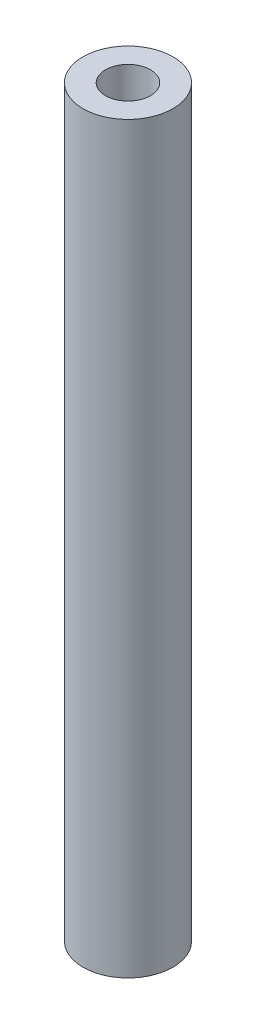
ISO-10303-21;
HEADER;
FILE_DESCRIPTION(('STEP AP214'),'2;1');
FILE_NAME('part.step','',(''),(''),'','','');
FILE_SCHEMA(('AUTOMOTIVE_DESIGN { 1 0 10303 214 1 1 1 1 }'));
ENDSEC;
DATA;
#1=APPLICATION_CONTEXT('core data for automotive mechanical design processes');
#2=APPLICATION_PROTOCOL_DEFINITION('international standard','automotive_design',2000,#1);
#3=PRODUCT_CONTEXT('',#1,'mechanical');
#4=PRODUCT('Part','Part','',(#3));
#5=PRODUCT_RELATED_PRODUCT_CATEGORY('part','',(#4));
#6=PRODUCT_DEFINITION_FORMATION('','',#4);
#7=PRODUCT_DEFINITION_CONTEXT('part definition',#1,'design');
#8=PRODUCT_DEFINITION('design','',#6,#7);
#9=PRODUCT_DEFINITION_SHAPE('','',#8);
#10=(LENGTH_UNIT() NAMED_UNIT(*) SI_UNIT(.MILLI.,.METRE.));
#11=(NAMED_UNIT(*) PLANE_ANGLE_UNIT() SI_UNIT($,.RADIAN.));
#12=(NAMED_UNIT(*) SI_UNIT($,.STERADIAN.) SOLID_ANGLE_UNIT());
#13=UNCERTAINTY_MEASURE_WITH_UNIT(LENGTH_MEASURE(1.E-05),#10,'distance_accuracy_value','');
#14=(GEOMETRIC_REPRESENTATION_CONTEXT(3) GLOBAL_UNCERTAINTY_ASSIGNED_CONTEXT((#13)) GLOBAL_UNIT_ASSIGNED_CONTEXT((#10,
#11,#12)) REPRESENTATION_CONTEXT('',''));
#15=CARTESIAN_POINT('',(0.,0.,0.));
#16=DIRECTION('',(0.,0.,1.));
#17=DIRECTION('',(1.,0.,0.));
#18=AXIS2_PLACEMENT_3D('',#15,#16,#17);
#19=CARTESIAN_POINT('',(0.,62.,0.));
#20=DIRECTION('',(0.,1.,0.));
#21=DIRECTION('',(0.,0.,1.));
#22=AXIS2_PLACEMENT_3D('',#19,#20,#21);
#23=PLANE('',#22);
#24=CARTESIAN_POINT('',(0.,62.,0.));
#25=DIRECTION('',(0.,1.,0.));
#26=DIRECTION('',(0.,0.,1.));
#27=AXIS2_PLACEMENT_3D('',#24,#25,#26);
#28=CIRCLE('',#27,3.75);
#29=CARTESIAN_POINT('',(0.,62.,3.75));
#30=VERTEX_POINT('',#29);
#31=EDGE_CURVE('E10',#30,#30,#28,.T.);
#32=ORIENTED_EDGE('',*,*,#31,.T.);
#33=EDGE_LOOP('',(#32));
#34=FACE_BOUND('',#33,.T.);
#35=CARTESIAN_POINT('',(0.,62.,0.));
#36=DIRECTION('',(0.,1.,0.));
#37=DIRECTION('',(0.,0.,1.));
#38=AXIS2_PLACEMENT_3D('',#35,#36,#37);
#39=CIRCLE('',#38,1.875);
#40=CARTESIAN_POINT('',(0.,62.,1.875));
#41=VERTEX_POINT('',#40);
#42=EDGE_CURVE('E42',#41,#41,#39,.T.);
#43=ORIENTED_EDGE('',*,*,#42,.F.);
#44=EDGE_LOOP('',(#43));
#45=FACE_BOUND('',#44,.T.);
#46=ADVANCED_FACE('F31',(#34,#45),#23,.T.);
#47=CARTESIAN_POINT('',(0.,0.,0.));
#48=DIRECTION('',(0.,1.,0.));
#49=DIRECTION('',(0.,0.,1.));
#50=AXIS2_PLACEMENT_3D('',#47,#48,#49);
#51=PLANE('',#50);
#52=CARTESIAN_POINT('',(0.,0.,0.));
#53=DIRECTION('',(0.,1.,0.));
#54=DIRECTION('',(0.,0.,1.));
#55=AXIS2_PLACEMENT_3D('',#52,#53,#54);
#56=CIRCLE('',#55,3.75);
#57=CARTESIAN_POINT('',(0.,0.,3.75));
#58=VERTEX_POINT('',#57);
#59=EDGE_CURVE('E35',#58,#58,#56,.T.);
#60=ORIENTED_EDGE('',*,*,#59,.F.);
#61=EDGE_LOOP('',(#60));
#62=FACE_BOUND('',#61,.T.);
#63=CARTESIAN_POINT('',(0.,0.,0.));
#64=DIRECTION('',(0.,1.,0.));
#65=DIRECTION('',(0.,0.,1.));
#66=AXIS2_PLACEMENT_3D('',#63,#64,#65);
#67=CIRCLE('',#66,1.875);
#68=CARTESIAN_POINT('',(0.,0.,1.875));
#69=VERTEX_POINT('',#68);
#70=EDGE_CURVE('E44',#69,#69,#67,.T.);
#71=ORIENTED_EDGE('',*,*,#70,.T.);
#72=EDGE_LOOP('',(#71));
#73=FACE_BOUND('',#72,.T.);
#74=ADVANCED_FACE('F54',(#62,#73),#51,.F.);
#75=CARTESIAN_POINT('',(0.,62.,0.));
#76=DIRECTION('',(0.,-1.,0.));
#77=DIRECTION('',(0.,0.,-1.));
#78=AXIS2_PLACEMENT_3D('',#75,#76,#77);
#79=CYLINDRICAL_SURFACE('',#78,3.75);
#80=ORIENTED_EDGE('',*,*,#31,.F.);
#81=EDGE_LOOP('',(#80));
#82=FACE_BOUND('',#81,.T.);
#83=ORIENTED_EDGE('',*,*,#59,.T.);
#84=EDGE_LOOP('',(#83));
#85=FACE_BOUND('',#84,.T.);
#86=ADVANCED_FACE('F33',(#82,#85),#79,.T.);
#87=CARTESIAN_POINT('',(0.,62.,0.));
#88=DIRECTION('',(0.,-1.,0.));
#89=DIRECTION('',(0.,0.,-1.));
#90=AXIS2_PLACEMENT_3D('',#87,#88,#89);
#91=CYLINDRICAL_SURFACE('',#90,1.875);
#92=ORIENTED_EDGE('',*,*,#42,.T.);
#93=EDGE_LOOP('',(#92));
#94=FACE_BOUND('',#93,.T.);
#95=ORIENTED_EDGE('',*,*,#70,.F.);
#96=EDGE_LOOP('',(#95));
#97=FACE_BOUND('',#96,.T.);
#98=ADVANCED_FACE('F50',(#94,#97),#91,.F.);
#99=CLOSED_SHELL('',(#46,#74,#86,#98));
#100=MANIFOLD_SOLID_BREP('B2',#99);
#101=ADVANCED_BREP_SHAPE_REPRESENTATION('',(#18,#100),#14);
#102=SHAPE_DEFINITION_REPRESENTATION(#9,#101);
ENDSEC;
END-ISO-10303-21;
